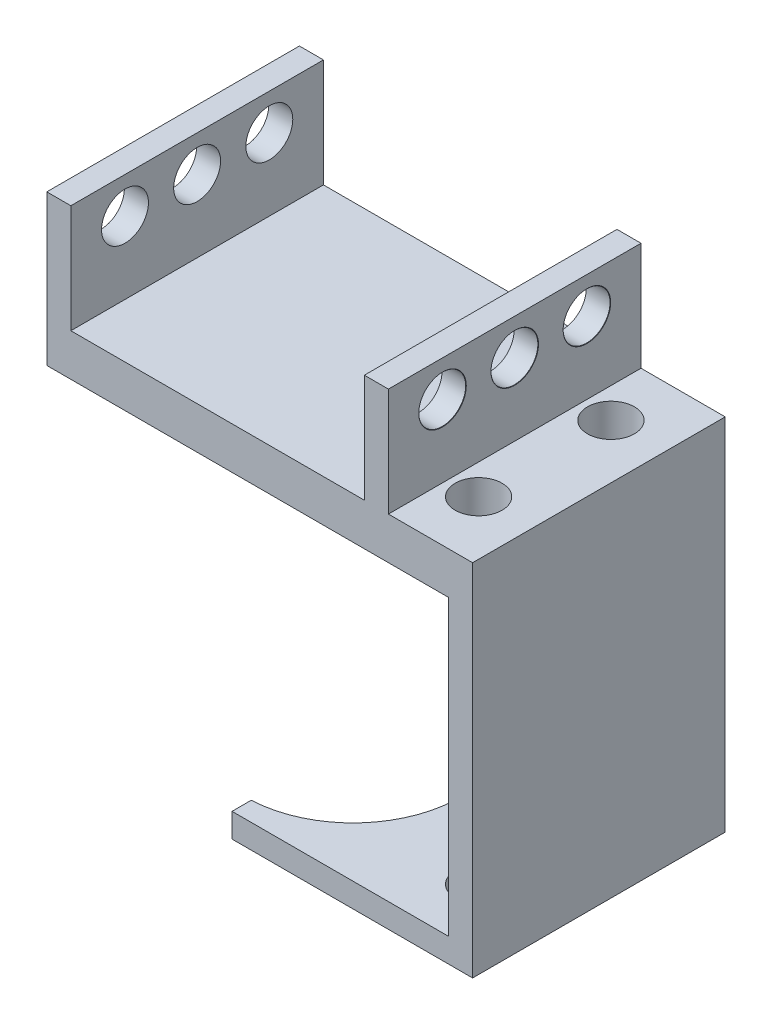
ISO-10303-21;
HEADER;
FILE_DESCRIPTION(('STEP AP214'),'2;1');
FILE_NAME('part.step','',(''),(''),'','','');
FILE_SCHEMA(('AUTOMOTIVE_DESIGN { 1 0 10303 214 1 1 1 1 }'));
ENDSEC;
DATA;
#1=APPLICATION_CONTEXT('core data for automotive mechanical design processes');
#2=APPLICATION_PROTOCOL_DEFINITION('international standard','automotive_design',2000,#1);
#3=PRODUCT_CONTEXT('',#1,'mechanical');
#4=PRODUCT('Part','Part','',(#3));
#5=PRODUCT_RELATED_PRODUCT_CATEGORY('part','',(#4));
#6=PRODUCT_DEFINITION_FORMATION('','',#4);
#7=PRODUCT_DEFINITION_CONTEXT('part definition',#1,'design');
#8=PRODUCT_DEFINITION('design','',#6,#7);
#9=PRODUCT_DEFINITION_SHAPE('','',#8);
#10=(LENGTH_UNIT() NAMED_UNIT(*) SI_UNIT(.MILLI.,.METRE.));
#11=(NAMED_UNIT(*) PLANE_ANGLE_UNIT() SI_UNIT($,.RADIAN.));
#12=(NAMED_UNIT(*) SI_UNIT($,.STERADIAN.) SOLID_ANGLE_UNIT());
#13=UNCERTAINTY_MEASURE_WITH_UNIT(LENGTH_MEASURE(1.E-05),#10,'distance_accuracy_value','');
#14=(GEOMETRIC_REPRESENTATION_CONTEXT(3) GLOBAL_UNCERTAINTY_ASSIGNED_CONTEXT((#13)) GLOBAL_UNIT_ASSIGNED_CONTEXT((#10,
#11,#12)) REPRESENTATION_CONTEXT('',''));
#15=CARTESIAN_POINT('',(0.,0.,0.));
#16=DIRECTION('',(0.,0.,1.));
#17=DIRECTION('',(1.,0.,0.));
#18=AXIS2_PLACEMENT_3D('',#15,#16,#17);
#19=CARTESIAN_POINT('',(1.42095576008853,-57.9,-21.));
#20=DIRECTION('',(-1.,0.,0.));
#21=DIRECTION('',(0.,0.,1.));
#22=AXIS2_PLACEMENT_3D('',#19,#20,#21);
#23=PLANE('',#22);
#24=DIRECTION('',(0.,-1.,0.));
#25=VECTOR('',#24,1.);
#26=CARTESIAN_POINT('',(1.42095576008853,-56.9,-19.3746327950174));
#27=LINE('',#26,#25);
#28=CARTESIAN_POINT('',(1.42095576008853,-57.9,-19.3746327950174));
#29=VERTEX_POINT('',#28);
#30=CARTESIAN_POINT('',(1.42095576008853,-59.9,-19.3746327950174));
#31=VERTEX_POINT('',#30);
#32=EDGE_CURVE('E288',#29,#31,#27,.T.);
#33=ORIENTED_EDGE('',*,*,#32,.F.);
#34=DIRECTION('',(0.,0.,1.));
#35=VECTOR('',#34,1.);
#36=CARTESIAN_POINT('',(1.42095576008853,-57.9,-21.));
#37=LINE('',#36,#35);
#38=CARTESIAN_POINT('',(1.42095576008853,-57.9,-21.));
#39=VERTEX_POINT('',#38);
#40=EDGE_CURVE('E239',#39,#29,#37,.T.);
#41=ORIENTED_EDGE('',*,*,#40,.F.);
#42=DIRECTION('',(0.,-1.,0.));
#43=VECTOR('',#42,1.);
#44=CARTESIAN_POINT('',(1.42095576008853,-57.9,-21.));
#45=LINE('',#44,#43);
#46=CARTESIAN_POINT('',(1.42095576008853,-59.9,-21.));
#47=VERTEX_POINT('',#46);
#48=EDGE_CURVE('E372',#39,#47,#45,.T.);
#49=ORIENTED_EDGE('',*,*,#48,.T.);
#50=DIRECTION('',(0.,0.,1.));
#51=VECTOR('',#50,1.);
#52=CARTESIAN_POINT('',(1.42095576008853,-59.9,-21.));
#53=LINE('',#52,#51);
#54=EDGE_CURVE('E235',#47,#31,#53,.T.);
#55=ORIENTED_EDGE('',*,*,#54,.T.);
#56=EDGE_LOOP('',(#33,#41,#49,#55));
#57=FACE_BOUND('',#56,.T.);
#58=ADVANCED_FACE('F39',(#57),#23,.T.);
#59=CARTESIAN_POINT('',(-13.9790442399115,-33.5,-21.));
#60=DIRECTION('',(-1.,0.,0.));
#61=DIRECTION('',(0.,0.,1.));
#62=AXIS2_PLACEMENT_3D('',#59,#60,#61);
#63=PLANE('',#62);
#64=CARTESIAN_POINT('',(-13.9790442399115,-24.,-4.49999999999993));
#65=DIRECTION('',(1.,0.,0.));
#66=DIRECTION('',(0.,0.,-1.));
#67=AXIS2_PLACEMENT_3D('',#64,#65,#66);
#68=CIRCLE('',#67,1.94999999999999);
#69=CARTESIAN_POINT('',(-13.9790442399115,-24.,-6.44999999999992));
#70=VERTEX_POINT('',#69);
#71=EDGE_CURVE('E263',#70,#70,#68,.T.);
#72=ORIENTED_EDGE('',*,*,#71,.T.);
#73=EDGE_LOOP('',(#72));
#74=FACE_BOUND('',#73,.T.);
#75=DIRECTION('',(0.,-1.,0.));
#76=VECTOR('',#75,1.);
#77=CARTESIAN_POINT('',(-13.9790442399115,-33.5,0.));
#78=LINE('',#77,#76);
#79=CARTESIAN_POINT('',(-13.9790442399115,-21.,0.));
#80=VERTEX_POINT('',#79);
#81=CARTESIAN_POINT('',(-13.9790442399115,-33.5,0.));
#82=VERTEX_POINT('',#81);
#83=EDGE_CURVE('E197',#80,#82,#78,.T.);
#84=ORIENTED_EDGE('',*,*,#83,.F.);
#85=DIRECTION('',(0.,0.,1.));
#86=VECTOR('',#85,1.);
#87=CARTESIAN_POINT('',(-13.9790442399115,-21.,-21.));
#88=LINE('',#87,#86);
#89=CARTESIAN_POINT('',(-13.9790442399115,-21.,-21.));
#90=VERTEX_POINT('',#89);
#91=EDGE_CURVE('E250',#90,#80,#88,.T.);
#92=ORIENTED_EDGE('',*,*,#91,.F.);
#93=DIRECTION('',(0.,-1.,0.));
#94=VECTOR('',#93,1.);
#95=CARTESIAN_POINT('',(-13.9790442399115,-33.5,-21.));
#96=LINE('',#95,#94);
#97=CARTESIAN_POINT('',(-13.9790442399115,-33.5,-21.));
#98=VERTEX_POINT('',#97);
#99=EDGE_CURVE('E361',#90,#98,#96,.T.);
#100=ORIENTED_EDGE('',*,*,#99,.T.);
#101=DIRECTION('',(0.,0.,1.));
#102=VECTOR('',#101,1.);
#103=CARTESIAN_POINT('',(-13.9790442399115,-33.5,-21.));
#104=LINE('',#103,#102);
#105=EDGE_CURVE('E247',#98,#82,#104,.T.);
#106=ORIENTED_EDGE('',*,*,#105,.T.);
#107=EDGE_LOOP('',(#84,#92,#100,#106));
#108=FACE_BOUND('',#107,.T.);
#109=CARTESIAN_POINT('',(-13.9790442399115,-24.,-16.4999999999999));
#110=DIRECTION('',(1.,0.,0.));
#111=DIRECTION('',(0.,0.,-1.));
#112=AXIS2_PLACEMENT_3D('',#109,#110,#111);
#113=CIRCLE('',#112,1.94999999999999);
#114=CARTESIAN_POINT('',(-13.9790442399115,-24.,-18.4499999999999));
#115=VERTEX_POINT('',#114);
#116=EDGE_CURVE('E347',#115,#115,#113,.T.);
#117=ORIENTED_EDGE('',*,*,#116,.T.);
#118=EDGE_LOOP('',(#117));
#119=FACE_BOUND('',#118,.T.);
#120=CARTESIAN_POINT('',(-13.9790442399115,-24.,-10.4999999999999));
#121=DIRECTION('',(1.,0.,0.));
#122=DIRECTION('',(0.,0.,-1.));
#123=AXIS2_PLACEMENT_3D('',#120,#121,#122);
#124=CIRCLE('',#123,1.94999999999999);
#125=CARTESIAN_POINT('',(-13.9790442399115,-24.,-12.4499999999999));
#126=VERTEX_POINT('',#125);
#127=EDGE_CURVE('E259',#126,#126,#124,.T.);
#128=ORIENTED_EDGE('',*,*,#127,.T.);
#129=EDGE_LOOP('',(#128));
#130=FACE_BOUND('',#129,.T.);
#131=ADVANCED_FACE('F418',(#74,#108,#119,#130),#63,.T.);
#132=CARTESIAN_POINT('',(12.4209557600885,-30.,-21.));
#133=DIRECTION('',(0.,1.,0.));
#134=DIRECTION('',(-1.,0.,0.));
#135=AXIS2_PLACEMENT_3D('',#132,#133,#134);
#136=PLANE('',#135);
#137=DIRECTION('',(-1.,0.,0.));
#138=VECTOR('',#137,1.);
#139=CARTESIAN_POINT('',(12.4209557600885,-30.,0.));
#140=LINE('',#139,#138);
#141=CARTESIAN_POINT('',(12.4209557600885,-30.,0.));
#142=VERTEX_POINT('',#141);
#143=CARTESIAN_POINT('',(-11.9790442399115,-30.,0.));
#144=VERTEX_POINT('',#143);
#145=EDGE_CURVE('E187',#142,#144,#140,.T.);
#146=ORIENTED_EDGE('',*,*,#145,.F.);
#147=DIRECTION('',(0.,0.,1.));
#148=VECTOR('',#147,1.);
#149=CARTESIAN_POINT('',(12.4209557600885,-30.,-21.));
#150=LINE('',#149,#148);
#151=CARTESIAN_POINT('',(12.4209557600885,-30.,-21.));
#152=VERTEX_POINT('',#151);
#153=EDGE_CURVE('E48',#152,#142,#150,.T.);
#154=ORIENTED_EDGE('',*,*,#153,.F.);
#155=DIRECTION('',(-1.,0.,0.));
#156=VECTOR('',#155,1.);
#157=CARTESIAN_POINT('',(12.4209557600885,-30.,-21.));
#158=LINE('',#157,#156);
#159=CARTESIAN_POINT('',(-11.9790442399115,-30.,-21.));
#160=VERTEX_POINT('',#159);
#161=EDGE_CURVE('E227',#152,#160,#158,.T.);
#162=ORIENTED_EDGE('',*,*,#161,.T.);
#163=DIRECTION('',(0.,0.,1.));
#164=VECTOR('',#163,1.);
#165=CARTESIAN_POINT('',(-11.9790442399115,-30.,-21.));
#166=LINE('',#165,#164);
#167=EDGE_CURVE('E120',#160,#144,#166,.T.);
#168=ORIENTED_EDGE('',*,*,#167,.T.);
#169=EDGE_LOOP('',(#146,#154,#162,#168));
#170=FACE_BOUND('',#169,.T.);
#171=ADVANCED_FACE('F41',(#170),#136,.T.);
#172=CARTESIAN_POINT('',(12.4209557600885,-21.,-21.));
#173=DIRECTION('',(-1.,0.,0.));
#174=DIRECTION('',(0.,0.,1.));
#175=AXIS2_PLACEMENT_3D('',#172,#173,#174);
#176=PLANE('',#175);
#177=CARTESIAN_POINT('',(12.4209557600885,-24.,-4.49999999999993));
#178=DIRECTION('',(-1.,0.,0.));
#179=DIRECTION('',(0.,0.,1.));
#180=AXIS2_PLACEMENT_3D('',#177,#178,#179);
#181=CIRCLE('',#180,1.95);
#182=CARTESIAN_POINT('',(12.4209557600885,-24.,-2.54999999999993));
#183=VERTEX_POINT('',#182);
#184=EDGE_CURVE('E262',#183,#183,#181,.T.);
#185=ORIENTED_EDGE('',*,*,#184,.F.);
#186=EDGE_LOOP('',(#185));
#187=FACE_BOUND('',#186,.T.);
#188=CARTESIAN_POINT('',(12.4209557600885,-24.,-10.4999999999999));
#189=DIRECTION('',(-1.,0.,0.));
#190=DIRECTION('',(0.,0.,1.));
#191=AXIS2_PLACEMENT_3D('',#188,#189,#190);
#192=CIRCLE('',#191,1.95);
#193=CARTESIAN_POINT('',(12.4209557600885,-24.,-8.54999999999993));
#194=VERTEX_POINT('',#193);
#195=EDGE_CURVE('E258',#194,#194,#192,.T.);
#196=ORIENTED_EDGE('',*,*,#195,.F.);
#197=EDGE_LOOP('',(#196));
#198=FACE_BOUND('',#197,.T.);
#199=CARTESIAN_POINT('',(12.4209557600885,-24.,-16.4999999999999));
#200=DIRECTION('',(-1.,0.,0.));
#201=DIRECTION('',(0.,0.,1.));
#202=AXIS2_PLACEMENT_3D('',#199,#200,#201);
#203=CIRCLE('',#202,1.95);
#204=CARTESIAN_POINT('',(12.4209557600885,-24.,-14.5499999999999));
#205=VERTEX_POINT('',#204);
#206=EDGE_CURVE('E191',#205,#205,#203,.T.);
#207=ORIENTED_EDGE('',*,*,#206,.F.);
#208=EDGE_LOOP('',(#207));
#209=FACE_BOUND('',#208,.T.);
#210=DIRECTION('',(0.,-1.,0.));
#211=VECTOR('',#210,1.);
#212=CARTESIAN_POINT('',(12.4209557600885,-21.,0.));
#213=LINE('',#212,#211);
#214=CARTESIAN_POINT('',(12.4209557600885,-21.,0.));
#215=VERTEX_POINT('',#214);
#216=EDGE_CURVE('E224',#215,#142,#213,.T.);
#217=ORIENTED_EDGE('',*,*,#216,.F.);
#218=DIRECTION('',(0.,0.,1.));
#219=VECTOR('',#218,1.);
#220=CARTESIAN_POINT('',(12.4209557600885,-21.,-21.));
#221=LINE('',#220,#219);
#222=CARTESIAN_POINT('',(12.4209557600885,-21.,-21.));
#223=VERTEX_POINT('',#222);
#224=EDGE_CURVE('E168',#223,#215,#221,.T.);
#225=ORIENTED_EDGE('',*,*,#224,.F.);
#226=DIRECTION('',(0.,-1.,0.));
#227=VECTOR('',#226,1.);
#228=CARTESIAN_POINT('',(12.4209557600885,-21.,-21.));
#229=LINE('',#228,#227);
#230=EDGE_CURVE('E177',#223,#152,#229,.T.);
#231=ORIENTED_EDGE('',*,*,#230,.T.);
#232=ORIENTED_EDGE('',*,*,#153,.T.);
#233=EDGE_LOOP('',(#217,#225,#231,#232));
#234=FACE_BOUND('',#233,.T.);
#235=ADVANCED_FACE('F424',(#187,#198,#209,#234),#176,.T.);
#236=CARTESIAN_POINT('',(12.4209557600885,-21.,-21.));
#237=DIRECTION('',(0.,1.,0.));
#238=DIRECTION('',(-1.,0.,0.));
#239=AXIS2_PLACEMENT_3D('',#236,#237,#238);
#240=PLANE('',#239);
#241=DIRECTION('',(-1.,0.,0.));
#242=VECTOR('',#241,1.);
#243=CARTESIAN_POINT('',(12.4209557600885,-21.,0.));
#244=LINE('',#243,#242);
#245=CARTESIAN_POINT('',(14.4209557600885,-21.,0.));
#246=VERTEX_POINT('',#245);
#247=EDGE_CURVE('E163',#246,#215,#244,.T.);
#248=ORIENTED_EDGE('',*,*,#247,.F.);
#249=DIRECTION('',(0.,0.,1.));
#250=VECTOR('',#249,1.);
#251=CARTESIAN_POINT('',(14.4209557600885,-21.,-21.));
#252=LINE('',#251,#250);
#253=CARTESIAN_POINT('',(14.4209557600885,-21.,-21.));
#254=VERTEX_POINT('',#253);
#255=EDGE_CURVE('E157',#254,#246,#252,.T.);
#256=ORIENTED_EDGE('',*,*,#255,.F.);
#257=DIRECTION('',(-1.,0.,0.));
#258=VECTOR('',#257,1.);
#259=CARTESIAN_POINT('',(12.4209557600885,-21.,-21.));
#260=LINE('',#259,#258);
#261=EDGE_CURVE('E160',#254,#223,#260,.T.);
#262=ORIENTED_EDGE('',*,*,#261,.T.);
#263=ORIENTED_EDGE('',*,*,#224,.T.);
#264=EDGE_LOOP('',(#248,#256,#262,#263));
#265=FACE_BOUND('',#264,.T.);
#266=ADVANCED_FACE('F159',(#265),#240,.T.);
#267=CARTESIAN_POINT('',(14.4209557600885,-21.,-21.));
#268=DIRECTION('',(1.,0.,0.));
#269=DIRECTION('',(0.,1.,0.));
#270=AXIS2_PLACEMENT_3D('',#267,#268,#269);
#271=PLANE('',#270);
#272=CARTESIAN_POINT('',(14.4209557600885,-24.,-4.49999999999993));
#273=DIRECTION('',(1.,0.,0.));
#274=DIRECTION('',(0.,0.,-1.));
#275=AXIS2_PLACEMENT_3D('',#272,#273,#274);
#276=CIRCLE('',#275,1.975);
#277=CARTESIAN_POINT('',(14.4209557600885,-24.,-6.47499999999993));
#278=VERTEX_POINT('',#277);
#279=EDGE_CURVE('E319',#278,#278,#276,.T.);
#280=ORIENTED_EDGE('',*,*,#279,.F.);
#281=EDGE_LOOP('',(#280));
#282=FACE_BOUND('',#281,.T.);
#283=CARTESIAN_POINT('',(14.4209557600885,-24.,-10.4999999999999));
#284=DIRECTION('',(1.,0.,0.));
#285=DIRECTION('',(0.,0.,-1.));
#286=AXIS2_PLACEMENT_3D('',#283,#284,#285);
#287=CIRCLE('',#286,1.975);
#288=CARTESIAN_POINT('',(14.4209557600885,-24.,-12.4749999999999));
#289=VERTEX_POINT('',#288);
#290=EDGE_CURVE('E331',#289,#289,#287,.T.);
#291=ORIENTED_EDGE('',*,*,#290,.F.);
#292=EDGE_LOOP('',(#291));
#293=FACE_BOUND('',#292,.T.);
#294=CARTESIAN_POINT('',(14.4209557600885,-24.,-16.4999999999999));
#295=DIRECTION('',(1.,0.,0.));
#296=DIRECTION('',(0.,0.,-1.));
#297=AXIS2_PLACEMENT_3D('',#294,#295,#296);
#298=CIRCLE('',#297,1.975);
#299=CARTESIAN_POINT('',(14.4209557600885,-24.,-18.4749999999999));
#300=VERTEX_POINT('',#299);
#301=EDGE_CURVE('E341',#300,#300,#298,.T.);
#302=ORIENTED_EDGE('',*,*,#301,.F.);
#303=EDGE_LOOP('',(#302));
#304=FACE_BOUND('',#303,.T.);
#305=DIRECTION('',(0.,1.,0.));
#306=VECTOR('',#305,1.);
#307=CARTESIAN_POINT('',(14.4209557600885,-21.,0.));
#308=LINE('',#307,#306);
#309=CARTESIAN_POINT('',(14.4209557600885,-30.,0.));
#310=VERTEX_POINT('',#309);
#311=EDGE_CURVE('E221',#310,#246,#308,.T.);
#312=ORIENTED_EDGE('',*,*,#311,.F.);
#313=DIRECTION('',(0.,0.,1.));
#314=VECTOR('',#313,1.);
#315=CARTESIAN_POINT('',(14.4209557600885,-30.,-21.));
#316=LINE('',#315,#314);
#317=CARTESIAN_POINT('',(14.4209557600885,-30.,-21.));
#318=VERTEX_POINT('',#317);
#319=EDGE_CURVE('E169',#318,#310,#316,.T.);
#320=ORIENTED_EDGE('',*,*,#319,.F.);
#321=DIRECTION('',(0.,1.,0.));
#322=VECTOR('',#321,1.);
#323=CARTESIAN_POINT('',(14.4209557600885,-21.,-21.));
#324=LINE('',#323,#322);
#325=EDGE_CURVE('E175',#318,#254,#324,.T.);
#326=ORIENTED_EDGE('',*,*,#325,.T.);
#327=ORIENTED_EDGE('',*,*,#255,.T.);
#328=EDGE_LOOP('',(#312,#320,#326,#327));
#329=FACE_BOUND('',#328,.T.);
#330=ADVANCED_FACE('F179',(#282,#293,#304,#329),#271,.T.);
#331=CARTESIAN_POINT('',(14.4209557600885,-30.,-21.));
#332=DIRECTION('',(0.,1.,0.));
#333=DIRECTION('',(0.,0.,1.));
#334=AXIS2_PLACEMENT_3D('',#331,#332,#333);
#335=PLANE('',#334);
#336=CARTESIAN_POINT('',(16.9209557600885,-30.,-16.));
#337=DIRECTION('',(0.,1.,0.));
#338=DIRECTION('',(0.,0.,1.));
#339=AXIS2_PLACEMENT_3D('',#336,#337,#338);
#340=CIRCLE('',#339,1.94999999999999);
#341=CARTESIAN_POINT('',(16.9209557600885,-30.,-14.05));
#342=VERTEX_POINT('',#341);
#343=EDGE_CURVE('E279',#342,#342,#340,.T.);
#344=ORIENTED_EDGE('',*,*,#343,.F.);
#345=EDGE_LOOP('',(#344));
#346=FACE_BOUND('',#345,.T.);
#347=CARTESIAN_POINT('',(16.9209557600885,-30.,-5.));
#348=DIRECTION('',(0.,1.,0.));
#349=DIRECTION('',(0.,0.,1.));
#350=AXIS2_PLACEMENT_3D('',#347,#348,#349);
#351=CIRCLE('',#350,1.94999999999999);
#352=CARTESIAN_POINT('',(16.9209557600885,-30.,-3.05000000000001));
#353=VERTEX_POINT('',#352);
#354=EDGE_CURVE('E271',#353,#353,#351,.T.);
#355=ORIENTED_EDGE('',*,*,#354,.F.);
#356=EDGE_LOOP('',(#355));
#357=FACE_BOUND('',#356,.T.);
#358=DIRECTION('',(-1.,0.,0.));
#359=VECTOR('',#358,1.);
#360=CARTESIAN_POINT('',(14.4209557600885,-30.,0.));
#361=LINE('',#360,#359);
#362=CARTESIAN_POINT('',(21.4209557600885,-30.,0.));
#363=VERTEX_POINT('',#362);
#364=EDGE_CURVE('E218',#363,#310,#361,.T.);
#365=ORIENTED_EDGE('',*,*,#364,.F.);
#366=DIRECTION('',(0.,0.,1.));
#367=VECTOR('',#366,1.);
#368=CARTESIAN_POINT('',(21.4209557600885,-30.,-21.));
#369=LINE('',#368,#367);
#370=CARTESIAN_POINT('',(21.4209557600885,-30.,-21.));
#371=VERTEX_POINT('',#370);
#372=EDGE_CURVE('E231',#371,#363,#369,.T.);
#373=ORIENTED_EDGE('',*,*,#372,.F.);
#374=DIRECTION('',(-1.,0.,0.));
#375=VECTOR('',#374,1.);
#376=CARTESIAN_POINT('',(14.4209557600885,-30.,-21.));
#377=LINE('',#376,#375);
#378=EDGE_CURVE('E180',#371,#318,#377,.T.);
#379=ORIENTED_EDGE('',*,*,#378,.T.);
#380=ORIENTED_EDGE('',*,*,#319,.T.);
#381=EDGE_LOOP('',(#365,#373,#379,#380));
#382=FACE_BOUND('',#381,.T.);
#383=ADVANCED_FACE('F426',(#346,#357,#382),#335,.T.);
#384=CARTESIAN_POINT('',(21.4209557600885,-30.,-21.));
#385=DIRECTION('',(1.,0.,0.));
#386=DIRECTION('',(0.,1.,0.));
#387=AXIS2_PLACEMENT_3D('',#384,#385,#386);
#388=PLANE('',#387);
#389=DIRECTION('',(0.,1.,0.));
#390=VECTOR('',#389,1.);
#391=CARTESIAN_POINT('',(21.4209557600885,-30.,0.));
#392=LINE('',#391,#390);
#393=CARTESIAN_POINT('',(21.4209557600885,-59.9,0.));
#394=VERTEX_POINT('',#393);
#395=EDGE_CURVE('E215',#394,#363,#392,.T.);
#396=ORIENTED_EDGE('',*,*,#395,.F.);
#397=DIRECTION('',(0.,0.,1.));
#398=VECTOR('',#397,1.);
#399=CARTESIAN_POINT('',(21.4209557600885,-59.9,-21.));
#400=LINE('',#399,#398);
#401=CARTESIAN_POINT('',(21.4209557600885,-59.9,-21.));
#402=VERTEX_POINT('',#401);
#403=EDGE_CURVE('E233',#402,#394,#400,.T.);
#404=ORIENTED_EDGE('',*,*,#403,.F.);
#405=DIRECTION('',(0.,1.,0.));
#406=VECTOR('',#405,1.);
#407=CARTESIAN_POINT('',(21.4209557600885,-30.,-21.));
#408=LINE('',#407,#406);
#409=EDGE_CURVE('E182',#402,#371,#408,.T.);
#410=ORIENTED_EDGE('',*,*,#409,.T.);
#411=ORIENTED_EDGE('',*,*,#372,.T.);
#412=EDGE_LOOP('',(#396,#404,#410,#411));
#413=FACE_BOUND('',#412,.T.);
#414=ADVANCED_FACE('F381',(#413),#388,.T.);
#415=CARTESIAN_POINT('',(1.42095576008853,-59.9,-21.));
#416=DIRECTION('',(0.,-1.,0.));
#417=DIRECTION('',(0.,0.,-1.));
#418=AXIS2_PLACEMENT_3D('',#415,#416,#417);
#419=PLANE('',#418);
#420=CARTESIAN_POINT('',(16.9209557600885,-59.9,-16.));
#421=DIRECTION('',(0.,-1.,0.));
#422=DIRECTION('',(0.,0.,-1.));
#423=AXIS2_PLACEMENT_3D('',#420,#421,#422);
#424=CIRCLE('',#423,1.975);
#425=CARTESIAN_POINT('',(16.9209557600885,-59.9,-17.975));
#426=VERTEX_POINT('',#425);
#427=EDGE_CURVE('E460',#426,#426,#424,.T.);
#428=ORIENTED_EDGE('',*,*,#427,.F.);
#429=EDGE_LOOP('',(#428));
#430=FACE_BOUND('',#429,.T.);
#431=CARTESIAN_POINT('',(16.9209557600885,-59.9,-5.));
#432=DIRECTION('',(0.,-1.,0.));
#433=DIRECTION('',(0.,0.,-1.));
#434=AXIS2_PLACEMENT_3D('',#431,#432,#433);
#435=CIRCLE('',#434,1.975);
#436=CARTESIAN_POINT('',(16.9209557600885,-59.9,-6.975));
#437=VERTEX_POINT('',#436);
#438=EDGE_CURVE('E274',#437,#437,#435,.T.);
#439=ORIENTED_EDGE('',*,*,#438,.F.);
#440=EDGE_LOOP('',(#439));
#441=FACE_BOUND('',#440,.T.);
#442=CARTESIAN_POINT('',(0.994754540356649,-59.9,-10.484843566903));
#443=DIRECTION('',(0.,-1.,0.));
#444=DIRECTION('',(0.,0.,-1.));
#445=AXIS2_PLACEMENT_3D('',#442,#443,#444);
#446=CIRCLE('',#445,8.9);
#447=CARTESIAN_POINT('',(1.42095576008853,-59.9,-1.59505433878858));
#448=VERTEX_POINT('',#447);
#449=EDGE_CURVE('E285',#31,#448,#446,.T.);
#450=ORIENTED_EDGE('',*,*,#449,.F.);
#451=ORIENTED_EDGE('',*,*,#54,.F.);
#452=DIRECTION('',(1.,0.,0.));
#453=VECTOR('',#452,1.);
#454=CARTESIAN_POINT('',(1.42095576008853,-59.9,-21.));
#455=LINE('',#454,#453);
#456=EDGE_CURVE('E375',#47,#402,#455,.T.);
#457=ORIENTED_EDGE('',*,*,#456,.T.);
#458=ORIENTED_EDGE('',*,*,#403,.T.);
#459=DIRECTION('',(1.,0.,0.));
#460=VECTOR('',#459,1.);
#461=CARTESIAN_POINT('',(1.42095576008853,-59.9,0.));
#462=LINE('',#461,#460);
#463=CARTESIAN_POINT('',(1.42095576008853,-59.9,0.));
#464=VERTEX_POINT('',#463);
#465=EDGE_CURVE('E212',#464,#394,#462,.T.);
#466=ORIENTED_EDGE('',*,*,#465,.F.);
#467=EDGE_CURVE('E238',#448,#464,#53,.T.);
#468=ORIENTED_EDGE('',*,*,#467,.F.);
#469=EDGE_LOOP('',(#450,#451,#457,#458,#466,#468));
#470=FACE_BOUND('',#469,.T.);
#471=ADVANCED_FACE('F387',(#430,#441,#470),#419,.T.);
#472=DIRECTION('',(0.,-1.,0.));
#473=VECTOR('',#472,1.);
#474=CARTESIAN_POINT('',(1.42095576008853,-56.9,-1.59505433878858));
#475=LINE('',#474,#473);
#476=CARTESIAN_POINT('',(1.42095576008853,-57.9,-1.59505433878858));
#477=VERTEX_POINT('',#476);
#478=EDGE_CURVE('E55',#448,#477,#475,.F.);
#479=ORIENTED_EDGE('',*,*,#478,.F.);
#480=ORIENTED_EDGE('',*,*,#467,.T.);
#481=DIRECTION('',(0.,-1.,0.));
#482=VECTOR('',#481,1.);
#483=CARTESIAN_POINT('',(1.42095576008853,-57.9,0.));
#484=LINE('',#483,#482);
#485=CARTESIAN_POINT('',(1.42095576008853,-57.9,0.));
#486=VERTEX_POINT('',#485);
#487=EDGE_CURVE('E209',#486,#464,#484,.T.);
#488=ORIENTED_EDGE('',*,*,#487,.F.);
#489=EDGE_CURVE('E242',#477,#486,#37,.T.);
#490=ORIENTED_EDGE('',*,*,#489,.F.);
#491=EDGE_LOOP('',(#479,#480,#488,#490));
#492=FACE_BOUND('',#491,.T.);
#493=ADVANCED_FACE('F402',(#492),#23,.T.);
#494=CARTESIAN_POINT('',(19.4209557600885,-57.9,-21.));
#495=DIRECTION('',(0.,1.,0.));
#496=DIRECTION('',(0.,0.,1.));
#497=AXIS2_PLACEMENT_3D('',#494,#495,#496);
#498=PLANE('',#497);
#499=CARTESIAN_POINT('',(16.9209557600885,-57.9,-16.));
#500=DIRECTION('',(0.,1.,0.));
#501=DIRECTION('',(0.,0.,1.));
#502=AXIS2_PLACEMENT_3D('',#499,#500,#501);
#503=CIRCLE('',#502,1.94999999999999);
#504=CARTESIAN_POINT('',(16.9209557600885,-57.9,-14.05));
#505=VERTEX_POINT('',#504);
#506=EDGE_CURVE('E828',#505,#505,#503,.T.);
#507=ORIENTED_EDGE('',*,*,#506,.F.);
#508=EDGE_LOOP('',(#507));
#509=FACE_BOUND('',#508,.T.);
#510=CARTESIAN_POINT('',(16.9209557600885,-57.9,-5.));
#511=DIRECTION('',(0.,1.,0.));
#512=DIRECTION('',(0.,0.,1.));
#513=AXIS2_PLACEMENT_3D('',#510,#511,#512);
#514=CIRCLE('',#513,1.94999999999999);
#515=CARTESIAN_POINT('',(16.9209557600885,-57.9,-3.05000000000001));
#516=VERTEX_POINT('',#515);
#517=EDGE_CURVE('E264',#516,#516,#514,.T.);
#518=ORIENTED_EDGE('',*,*,#517,.F.);
#519=EDGE_LOOP('',(#518));
#520=FACE_BOUND('',#519,.T.);
#521=CARTESIAN_POINT('',(0.994754540356649,-57.9,-10.484843566903));
#522=DIRECTION('',(0.,1.,0.));
#523=DIRECTION('',(0.,0.,1.));
#524=AXIS2_PLACEMENT_3D('',#521,#522,#523);
#525=CIRCLE('',#524,8.9);
#526=EDGE_CURVE('E12',#477,#29,#525,.T.);
#527=ORIENTED_EDGE('',*,*,#526,.F.);
#528=ORIENTED_EDGE('',*,*,#489,.T.);
#529=DIRECTION('',(-1.,0.,0.));
#530=VECTOR('',#529,1.);
#531=CARTESIAN_POINT('',(19.4209557600885,-57.9,0.));
#532=LINE('',#531,#530);
#533=CARTESIAN_POINT('',(19.4209557600885,-57.9,0.));
#534=VERTEX_POINT('',#533);
#535=EDGE_CURVE('E206',#534,#486,#532,.T.);
#536=ORIENTED_EDGE('',*,*,#535,.F.);
#537=DIRECTION('',(0.,0.,1.));
#538=VECTOR('',#537,1.);
#539=CARTESIAN_POINT('',(19.4209557600885,-57.9,-21.));
#540=LINE('',#539,#538);
#541=CARTESIAN_POINT('',(19.4209557600885,-57.9,-21.));
#542=VERTEX_POINT('',#541);
#543=EDGE_CURVE('E243',#542,#534,#540,.T.);
#544=ORIENTED_EDGE('',*,*,#543,.F.);
#545=DIRECTION('',(-1.,0.,0.));
#546=VECTOR('',#545,1.);
#547=CARTESIAN_POINT('',(19.4209557600885,-57.9,-21.));
#548=LINE('',#547,#546);
#549=EDGE_CURVE('E369',#542,#39,#548,.T.);
#550=ORIENTED_EDGE('',*,*,#549,.T.);
#551=ORIENTED_EDGE('',*,*,#40,.T.);
#552=EDGE_LOOP('',(#527,#528,#536,#544,#550,#551));
#553=FACE_BOUND('',#552,.T.);
#554=ADVANCED_FACE('F398',(#509,#520,#553),#498,.T.);
#555=CARTESIAN_POINT('',(19.4209557600885,-33.5,-21.));
#556=DIRECTION('',(-1.,0.,0.));
#557=DIRECTION('',(0.,-1.,0.));
#558=AXIS2_PLACEMENT_3D('',#555,#556,#557);
#559=PLANE('',#558);
#560=DIRECTION('',(0.,-1.,0.));
#561=VECTOR('',#560,1.);
#562=CARTESIAN_POINT('',(19.4209557600885,-33.5,0.));
#563=LINE('',#562,#561);
#564=CARTESIAN_POINT('',(19.4209557600885,-33.5,0.));
#565=VERTEX_POINT('',#564);
#566=EDGE_CURVE('E203',#565,#534,#563,.T.);
#567=ORIENTED_EDGE('',*,*,#566,.F.);
#568=DIRECTION('',(0.,0.,1.));
#569=VECTOR('',#568,1.);
#570=CARTESIAN_POINT('',(19.4209557600885,-33.5,-21.));
#571=LINE('',#570,#569);
#572=CARTESIAN_POINT('',(19.4209557600885,-33.5,-21.));
#573=VERTEX_POINT('',#572);
#574=EDGE_CURVE('E245',#573,#565,#571,.T.);
#575=ORIENTED_EDGE('',*,*,#574,.F.);
#576=DIRECTION('',(0.,-1.,0.));
#577=VECTOR('',#576,1.);
#578=CARTESIAN_POINT('',(19.4209557600885,-33.5,-21.));
#579=LINE('',#578,#577);
#580=EDGE_CURVE('E366',#573,#542,#579,.T.);
#581=ORIENTED_EDGE('',*,*,#580,.T.);
#582=ORIENTED_EDGE('',*,*,#543,.T.);
#583=EDGE_LOOP('',(#567,#575,#581,#582));
#584=FACE_BOUND('',#583,.T.);
#585=ADVANCED_FACE('F411',(#584),#559,.T.);
#586=CARTESIAN_POINT('',(19.4209557600885,-33.5,-21.));
#587=DIRECTION('',(0.,-1.,0.));
#588=DIRECTION('',(0.,0.,-1.));
#589=AXIS2_PLACEMENT_3D('',#586,#587,#588);
#590=PLANE('',#589);
#591=CARTESIAN_POINT('',(16.9209557600885,-33.5,-16.));
#592=DIRECTION('',(0.,-1.,0.));
#593=DIRECTION('',(0.,0.,-1.));
#594=AXIS2_PLACEMENT_3D('',#591,#592,#593);
#595=CIRCLE('',#594,1.94999999999999);
#596=CARTESIAN_POINT('',(16.9209557600885,-33.5,-17.95));
#597=VERTEX_POINT('',#596);
#598=EDGE_CURVE('E43',#597,#597,#595,.T.);
#599=ORIENTED_EDGE('',*,*,#598,.F.);
#600=EDGE_LOOP('',(#599));
#601=FACE_BOUND('',#600,.T.);
#602=CARTESIAN_POINT('',(16.9209557600885,-33.5,-5.));
#603=DIRECTION('',(0.,-1.,0.));
#604=DIRECTION('',(0.,0.,-1.));
#605=AXIS2_PLACEMENT_3D('',#602,#603,#604);
#606=CIRCLE('',#605,1.94999999999999);
#607=CARTESIAN_POINT('',(16.9209557600885,-33.5,-6.94999999999999));
#608=VERTEX_POINT('',#607);
#609=EDGE_CURVE('E266',#608,#608,#606,.T.);
#610=ORIENTED_EDGE('',*,*,#609,.F.);
#611=EDGE_LOOP('',(#610));
#612=FACE_BOUND('',#611,.T.);
#613=CARTESIAN_POINT('',(1.42095576008852,-33.5,-10.5));
#614=DIRECTION('',(0.,-1.,0.));
#615=DIRECTION('',(1.,0.,0.));
#616=AXIS2_PLACEMENT_3D('',#613,#614,#615);
#617=CIRCLE('',#616,9.00000000000001);
#618=CARTESIAN_POINT('',(10.4209557600885,-33.5,-10.5));
#619=VERTEX_POINT('',#618);
#620=EDGE_CURVE('E313',#619,#619,#617,.T.);
#621=ORIENTED_EDGE('',*,*,#620,.F.);
#622=EDGE_LOOP('',(#621));
#623=FACE_BOUND('',#622,.T.);
#624=DIRECTION('',(1.,0.,0.));
#625=VECTOR('',#624,1.);
#626=CARTESIAN_POINT('',(19.4209557600885,-33.5,0.));
#627=LINE('',#626,#625);
#628=EDGE_CURVE('E200',#82,#565,#627,.T.);
#629=ORIENTED_EDGE('',*,*,#628,.F.);
#630=ORIENTED_EDGE('',*,*,#105,.F.);
#631=DIRECTION('',(1.,0.,0.));
#632=VECTOR('',#631,1.);
#633=CARTESIAN_POINT('',(14.4209557600885,-33.5,-21.));
#634=LINE('',#633,#632);
#635=EDGE_CURVE('E364',#98,#573,#634,.T.);
#636=ORIENTED_EDGE('',*,*,#635,.T.);
#637=ORIENTED_EDGE('',*,*,#574,.T.);
#638=EDGE_LOOP('',(#629,#630,#636,#637));
#639=FACE_BOUND('',#638,.T.);
#640=ADVANCED_FACE('F413',(#601,#612,#623,#639),#590,.T.);
#641=CARTESIAN_POINT('',(-13.9790442399115,-21.,-21.));
#642=DIRECTION('',(0.,1.,0.));
#643=DIRECTION('',(0.,0.,1.));
#644=AXIS2_PLACEMENT_3D('',#641,#642,#643);
#645=PLANE('',#644);
#646=DIRECTION('',(-1.,0.,0.));
#647=VECTOR('',#646,1.);
#648=CARTESIAN_POINT('',(-13.9790442399115,-21.,0.));
#649=LINE('',#648,#647);
#650=CARTESIAN_POINT('',(-11.9790442399115,-21.,0.));
#651=VERTEX_POINT('',#650);
#652=EDGE_CURVE('E194',#651,#80,#649,.T.);
#653=ORIENTED_EDGE('',*,*,#652,.F.);
#654=DIRECTION('',(0.,0.,1.));
#655=VECTOR('',#654,1.);
#656=CARTESIAN_POINT('',(-11.9790442399115,-21.,-21.));
#657=LINE('',#656,#655);
#658=CARTESIAN_POINT('',(-11.9790442399115,-21.,-21.));
#659=VERTEX_POINT('',#658);
#660=EDGE_CURVE('E252',#659,#651,#657,.T.);
#661=ORIENTED_EDGE('',*,*,#660,.F.);
#662=DIRECTION('',(-1.,0.,0.));
#663=VECTOR('',#662,1.);
#664=CARTESIAN_POINT('',(-13.9790442399115,-21.,-21.));
#665=LINE('',#664,#663);
#666=EDGE_CURVE('E358',#659,#90,#665,.T.);
#667=ORIENTED_EDGE('',*,*,#666,.T.);
#668=ORIENTED_EDGE('',*,*,#91,.T.);
#669=EDGE_LOOP('',(#653,#661,#667,#668));
#670=FACE_BOUND('',#669,.T.);
#671=ADVANCED_FACE('F422',(#670),#645,.T.);
#672=CARTESIAN_POINT('',(-11.9790442399115,-30.,-21.));
#673=DIRECTION('',(1.,0.,0.));
#674=DIRECTION('',(0.,0.,-1.));
#675=AXIS2_PLACEMENT_3D('',#672,#673,#674);
#676=PLANE('',#675);
#677=CARTESIAN_POINT('',(-11.9790442399115,-24.,-4.49999999999993));
#678=DIRECTION('',(1.,0.,0.));
#679=DIRECTION('',(0.,0.,-1.));
#680=AXIS2_PLACEMENT_3D('',#677,#678,#679);
#681=CIRCLE('',#680,1.95);
#682=CARTESIAN_POINT('',(-11.9790442399115,-24.,-6.44999999999992));
#683=VERTEX_POINT('',#682);
#684=EDGE_CURVE('E260',#683,#683,#681,.T.);
#685=ORIENTED_EDGE('',*,*,#684,.F.);
#686=EDGE_LOOP('',(#685));
#687=FACE_BOUND('',#686,.T.);
#688=CARTESIAN_POINT('',(-11.9790442399115,-24.,-10.4999999999999));
#689=DIRECTION('',(1.,0.,0.));
#690=DIRECTION('',(0.,0.,-1.));
#691=AXIS2_PLACEMENT_3D('',#688,#689,#690);
#692=CIRCLE('',#691,1.95);
#693=CARTESIAN_POINT('',(-11.9790442399115,-24.,-12.4499999999999));
#694=VERTEX_POINT('',#693);
#695=EDGE_CURVE('E255',#694,#694,#692,.T.);
#696=ORIENTED_EDGE('',*,*,#695,.F.);
#697=EDGE_LOOP('',(#696));
#698=FACE_BOUND('',#697,.T.);
#699=CARTESIAN_POINT('',(-11.9790442399115,-24.,-16.4999999999999));
#700=DIRECTION('',(1.,0.,0.));
#701=DIRECTION('',(0.,0.,-1.));
#702=AXIS2_PLACEMENT_3D('',#699,#700,#701);
#703=CIRCLE('',#702,1.95);
#704=CARTESIAN_POINT('',(-11.9790442399115,-24.,-18.4499999999999));
#705=VERTEX_POINT('',#704);
#706=EDGE_CURVE('E350',#705,#705,#703,.T.);
#707=ORIENTED_EDGE('',*,*,#706,.F.);
#708=EDGE_LOOP('',(#707));
#709=FACE_BOUND('',#708,.T.);
#710=DIRECTION('',(0.,1.,0.));
#711=VECTOR('',#710,1.);
#712=CARTESIAN_POINT('',(-11.9790442399115,-30.,0.));
#713=LINE('',#712,#711);
#714=EDGE_CURVE('E190',#144,#651,#713,.T.);
#715=ORIENTED_EDGE('',*,*,#714,.F.);
#716=ORIENTED_EDGE('',*,*,#167,.F.);
#717=DIRECTION('',(0.,1.,0.));
#718=VECTOR('',#717,1.);
#719=CARTESIAN_POINT('',(-11.9790442399115,-30.,-21.));
#720=LINE('',#719,#718);
#721=EDGE_CURVE('E356',#160,#659,#720,.T.);
#722=ORIENTED_EDGE('',*,*,#721,.T.);
#723=ORIENTED_EDGE('',*,*,#660,.T.);
#724=EDGE_LOOP('',(#715,#716,#722,#723));
#725=FACE_BOUND('',#724,.T.);
#726=ADVANCED_FACE('F423',(#687,#698,#709,#725),#676,.T.);
#727=CARTESIAN_POINT('',(0.,0.,-21.));
#728=DIRECTION('',(0.,0.,-1.));
#729=DIRECTION('',(-1.,0.,0.));
#730=AXIS2_PLACEMENT_3D('',#727,#728,#729);
#731=PLANE('',#730);
#732=ORIENTED_EDGE('',*,*,#161,.F.);
#733=ORIENTED_EDGE('',*,*,#230,.F.);
#734=ORIENTED_EDGE('',*,*,#261,.F.);
#735=ORIENTED_EDGE('',*,*,#325,.F.);
#736=ORIENTED_EDGE('',*,*,#378,.F.);
#737=ORIENTED_EDGE('',*,*,#409,.F.);
#738=ORIENTED_EDGE('',*,*,#456,.F.);
#739=ORIENTED_EDGE('',*,*,#48,.F.);
#740=ORIENTED_EDGE('',*,*,#549,.F.);
#741=ORIENTED_EDGE('',*,*,#580,.F.);
#742=ORIENTED_EDGE('',*,*,#635,.F.);
#743=ORIENTED_EDGE('',*,*,#99,.F.);
#744=ORIENTED_EDGE('',*,*,#666,.F.);
#745=ORIENTED_EDGE('',*,*,#721,.F.);
#746=EDGE_LOOP('',(#732,#733,#734,#735,#736,#737,#738,#739,#740,#741,#742,#743,#744,#745));
#747=FACE_BOUND('',#746,.T.);
#748=ADVANCED_FACE('F173',(#747),#731,.T.);
#749=CARTESIAN_POINT('',(0.,0.,0.));
#750=DIRECTION('',(0.,0.,-1.));
#751=DIRECTION('',(-1.,0.,0.));
#752=AXIS2_PLACEMENT_3D('',#749,#750,#751);
#753=PLANE('',#752);
#754=ORIENTED_EDGE('',*,*,#145,.T.);
#755=ORIENTED_EDGE('',*,*,#714,.T.);
#756=ORIENTED_EDGE('',*,*,#652,.T.);
#757=ORIENTED_EDGE('',*,*,#83,.T.);
#758=ORIENTED_EDGE('',*,*,#628,.T.);
#759=ORIENTED_EDGE('',*,*,#566,.T.);
#760=ORIENTED_EDGE('',*,*,#535,.T.);
#761=ORIENTED_EDGE('',*,*,#487,.T.);
#762=ORIENTED_EDGE('',*,*,#465,.T.);
#763=ORIENTED_EDGE('',*,*,#395,.T.);
#764=ORIENTED_EDGE('',*,*,#364,.T.);
#765=ORIENTED_EDGE('',*,*,#311,.T.);
#766=ORIENTED_EDGE('',*,*,#247,.T.);
#767=ORIENTED_EDGE('',*,*,#216,.T.);
#768=EDGE_LOOP('',(#754,#755,#756,#757,#758,#759,#760,#761,#762,#763,#764,#765,#766,#767));
#769=FACE_BOUND('',#768,.T.);
#770=ADVANCED_FACE('F404',(#769),#753,.F.);
#771=CARTESIAN_POINT('',(14.4209557600885,-24.,-16.4999999999999));
#772=DIRECTION('',(1.,0.,0.));
#773=DIRECTION('',(0.,0.,-1.));
#774=AXIS2_PLACEMENT_3D('',#771,#772,#773);
#775=CYLINDRICAL_SURFACE('',#774,1.95);
#776=ORIENTED_EDGE('',*,*,#706,.T.);
#777=EDGE_LOOP('',(#776));
#778=FACE_BOUND('',#777,.T.);
#779=ORIENTED_EDGE('',*,*,#116,.F.);
#780=EDGE_LOOP('',(#779));
#781=FACE_BOUND('',#780,.T.);
#782=ADVANCED_FACE('F530',(#778,#781),#775,.F.);
#783=ORIENTED_EDGE('',*,*,#206,.T.);
#784=EDGE_LOOP('',(#783));
#785=FACE_BOUND('',#784,.T.);
#786=CARTESIAN_POINT('',(14.3959557600885,-24.,-16.4999999999999));
#787=DIRECTION('',(1.,0.,0.));
#788=DIRECTION('',(0.,0.,-1.));
#789=AXIS2_PLACEMENT_3D('',#786,#787,#788);
#790=CIRCLE('',#789,1.95);
#791=CARTESIAN_POINT('',(14.3959557600885,-24.,-18.4499999999999));
#792=VERTEX_POINT('',#791);
#793=EDGE_CURVE('E344',#792,#792,#790,.T.);
#794=ORIENTED_EDGE('',*,*,#793,.T.);
#795=EDGE_LOOP('',(#794));
#796=FACE_BOUND('',#795,.T.);
#797=ADVANCED_FACE('F528',(#785,#796),#775,.F.);
#798=CARTESIAN_POINT('',(14.4209557600885,-24.,-16.4999999999999));
#799=DIRECTION('',(1.,0.,0.));
#800=DIRECTION('',(0.,0.,-1.));
#801=AXIS2_PLACEMENT_3D('',#798,#799,#800);
#802=CONICAL_SURFACE('',#801,1.975,0.785398163397483);
#803=ORIENTED_EDGE('',*,*,#793,.F.);
#804=EDGE_LOOP('',(#803));
#805=FACE_BOUND('',#804,.T.);
#806=ORIENTED_EDGE('',*,*,#301,.T.);
#807=EDGE_LOOP('',(#806));
#808=FACE_BOUND('',#807,.T.);
#809=ADVANCED_FACE('F524',(#805,#808),#802,.F.);
#810=CARTESIAN_POINT('',(14.4209557600885,-24.,-10.4999999999999));
#811=DIRECTION('',(1.,0.,0.));
#812=DIRECTION('',(0.,0.,-1.));
#813=AXIS2_PLACEMENT_3D('',#810,#811,#812);
#814=CYLINDRICAL_SURFACE('',#813,1.95);
#815=ORIENTED_EDGE('',*,*,#695,.T.);
#816=EDGE_LOOP('',(#815));
#817=FACE_BOUND('',#816,.T.);
#818=ORIENTED_EDGE('',*,*,#127,.F.);
#819=EDGE_LOOP('',(#818));
#820=FACE_BOUND('',#819,.T.);
#821=ADVANCED_FACE('F521',(#817,#820),#814,.F.);
#822=ORIENTED_EDGE('',*,*,#195,.T.);
#823=EDGE_LOOP('',(#822));
#824=FACE_BOUND('',#823,.T.);
#825=CARTESIAN_POINT('',(14.3959557600885,-24.,-10.4999999999999));
#826=DIRECTION('',(1.,0.,0.));
#827=DIRECTION('',(0.,0.,-1.));
#828=AXIS2_PLACEMENT_3D('',#825,#826,#827);
#829=CIRCLE('',#828,1.95);
#830=CARTESIAN_POINT('',(14.3959557600885,-24.,-12.4499999999999));
#831=VERTEX_POINT('',#830);
#832=EDGE_CURVE('E334',#831,#831,#829,.T.);
#833=ORIENTED_EDGE('',*,*,#832,.T.);
#834=EDGE_LOOP('',(#833));
#835=FACE_BOUND('',#834,.T.);
#836=ADVANCED_FACE('F519',(#824,#835),#814,.F.);
#837=CARTESIAN_POINT('',(14.4209557600885,-24.,-10.4999999999999));
#838=DIRECTION('',(1.,0.,0.));
#839=DIRECTION('',(0.,0.,-1.));
#840=AXIS2_PLACEMENT_3D('',#837,#838,#839);
#841=CONICAL_SURFACE('',#840,1.975,0.785398163397483);
#842=ORIENTED_EDGE('',*,*,#832,.F.);
#843=EDGE_LOOP('',(#842));
#844=FACE_BOUND('',#843,.T.);
#845=ORIENTED_EDGE('',*,*,#290,.T.);
#846=EDGE_LOOP('',(#845));
#847=FACE_BOUND('',#846,.T.);
#848=ADVANCED_FACE('F512',(#844,#847),#841,.F.);
#849=CARTESIAN_POINT('',(14.4209557600885,-24.,-4.49999999999993));
#850=DIRECTION('',(1.,0.,0.));
#851=DIRECTION('',(0.,0.,-1.));
#852=AXIS2_PLACEMENT_3D('',#849,#850,#851);
#853=CONICAL_SURFACE('',#852,1.975,0.785398163397483);
#854=CARTESIAN_POINT('',(14.3959557600885,-24.,-4.49999999999993));
#855=DIRECTION('',(1.,0.,0.));
#856=DIRECTION('',(0.,0.,-1.));
#857=AXIS2_PLACEMENT_3D('',#854,#855,#856);
#858=CIRCLE('',#857,1.95);
#859=CARTESIAN_POINT('',(14.3959557600885,-24.,-6.44999999999992));
#860=VERTEX_POINT('',#859);
#861=EDGE_CURVE('E324',#860,#860,#858,.T.);
#862=ORIENTED_EDGE('',*,*,#861,.F.);
#863=EDGE_LOOP('',(#862));
#864=FACE_BOUND('',#863,.T.);
#865=ORIENTED_EDGE('',*,*,#279,.T.);
#866=EDGE_LOOP('',(#865));
#867=FACE_BOUND('',#866,.T.);
#868=ADVANCED_FACE('F508',(#864,#867),#853,.F.);
#869=CARTESIAN_POINT('',(14.4209557600885,-24.,-4.49999999999993));
#870=DIRECTION('',(1.,0.,0.));
#871=DIRECTION('',(0.,0.,-1.));
#872=AXIS2_PLACEMENT_3D('',#869,#870,#871);
#873=CYLINDRICAL_SURFACE('',#872,1.95);
#874=ORIENTED_EDGE('',*,*,#184,.T.);
#875=EDGE_LOOP('',(#874));
#876=FACE_BOUND('',#875,.T.);
#877=ORIENTED_EDGE('',*,*,#861,.T.);
#878=EDGE_LOOP('',(#877));
#879=FACE_BOUND('',#878,.T.);
#880=ADVANCED_FACE('F511',(#876,#879),#873,.F.);
#881=ORIENTED_EDGE('',*,*,#684,.T.);
#882=EDGE_LOOP('',(#881));
#883=FACE_BOUND('',#882,.T.);
#884=ORIENTED_EDGE('',*,*,#71,.F.);
#885=EDGE_LOOP('',(#884));
#886=FACE_BOUND('',#885,.T.);
#887=ADVANCED_FACE('F506',(#883,#886),#873,.F.);
#888=CARTESIAN_POINT('',(1.42095576008852,-30.5,-10.5));
#889=DIRECTION('',(0.,-1.,0.));
#890=DIRECTION('',(1.,0.,0.));
#891=AXIS2_PLACEMENT_3D('',#888,#889,#890);
#892=CYLINDRICAL_SURFACE('',#891,9.00000000000001);
#893=CARTESIAN_POINT('',(1.42095576008852,-30.5,-10.5));
#894=DIRECTION('',(0.,-1.,0.));
#895=DIRECTION('',(1.,0.,0.));
#896=AXIS2_PLACEMENT_3D('',#893,#894,#895);
#897=CIRCLE('',#896,9.00000000000001);
#898=CARTESIAN_POINT('',(10.4209557600885,-30.5,-10.5));
#899=VERTEX_POINT('',#898);
#900=EDGE_CURVE('E316',#899,#899,#897,.T.);
#901=ORIENTED_EDGE('',*,*,#900,.F.);
#902=EDGE_LOOP('',(#901));
#903=FACE_BOUND('',#902,.T.);
#904=ORIENTED_EDGE('',*,*,#620,.T.);
#905=EDGE_LOOP('',(#904));
#906=FACE_BOUND('',#905,.T.);
#907=ADVANCED_FACE('F502',(#903,#906),#892,.F.);
#908=CARTESIAN_POINT('',(1.42095576008852,-30.5,-10.5));
#909=DIRECTION('',(0.,-1.,0.));
#910=DIRECTION('',(1.,0.,0.));
#911=AXIS2_PLACEMENT_3D('',#908,#909,#910);
#912=PLANE('',#911);
#913=CARTESIAN_POINT('',(7.42095576008852,-30.5,-10.5));
#914=DIRECTION('',(0.,-1.,0.));
#915=DIRECTION('',(1.,0.,0.));
#916=AXIS2_PLACEMENT_3D('',#913,#914,#915);
#917=CIRCLE('',#916,2.00000000000001);
#918=CARTESIAN_POINT('',(9.42095576008853,-30.5,-10.5));
#919=VERTEX_POINT('',#918);
#920=EDGE_CURVE('E292',#919,#919,#917,.T.);
#921=ORIENTED_EDGE('',*,*,#920,.F.);
#922=EDGE_LOOP('',(#921));
#923=FACE_BOUND('',#922,.T.);
#924=CARTESIAN_POINT('',(-4.57904423991148,-30.5,-10.5));
#925=DIRECTION('',(0.,-1.,0.));
#926=DIRECTION('',(1.,0.,0.));
#927=AXIS2_PLACEMENT_3D('',#924,#925,#926);
#928=CIRCLE('',#927,2.);
#929=CARTESIAN_POINT('',(-2.57904423991148,-30.5,-10.5));
#930=VERTEX_POINT('',#929);
#931=EDGE_CURVE('E298',#930,#930,#928,.T.);
#932=ORIENTED_EDGE('',*,*,#931,.F.);
#933=EDGE_LOOP('',(#932));
#934=FACE_BOUND('',#933,.T.);
#935=CARTESIAN_POINT('',(1.42095576008852,-30.5,-16.5));
#936=DIRECTION('',(0.,-1.,0.));
#937=DIRECTION('',(1.,0.,0.));
#938=AXIS2_PLACEMENT_3D('',#935,#936,#937);
#939=CIRCLE('',#938,2.00000000000001);
#940=CARTESIAN_POINT('',(3.42095576008853,-30.5,-16.5));
#941=VERTEX_POINT('',#940);
#942=EDGE_CURVE('E304',#941,#941,#939,.T.);
#943=ORIENTED_EDGE('',*,*,#942,.F.);
#944=EDGE_LOOP('',(#943));
#945=FACE_BOUND('',#944,.T.);
#946=CARTESIAN_POINT('',(1.42095576008852,-30.5,-4.5));
#947=DIRECTION('',(0.,-1.,0.));
#948=DIRECTION('',(1.,0.,0.));
#949=AXIS2_PLACEMENT_3D('',#946,#947,#948);
#950=CIRCLE('',#949,2.);
#951=CARTESIAN_POINT('',(3.42095576008853,-30.5,-4.5));
#952=VERTEX_POINT('',#951);
#953=EDGE_CURVE('E310',#952,#952,#950,.T.);
#954=ORIENTED_EDGE('',*,*,#953,.F.);
#955=EDGE_LOOP('',(#954));
#956=FACE_BOUND('',#955,.T.);
#957=ORIENTED_EDGE('',*,*,#900,.T.);
#958=EDGE_LOOP('',(#957));
#959=FACE_BOUND('',#958,.T.);
#960=ADVANCED_FACE('F498',(#923,#934,#945,#956,#959),#912,.T.);
#961=CARTESIAN_POINT('',(1.42095576008852,-30.5,-4.5));
#962=DIRECTION('',(0.,-1.,0.));
#963=DIRECTION('',(1.,0.,0.));
#964=AXIS2_PLACEMENT_3D('',#961,#962,#963);
#965=CYLINDRICAL_SURFACE('',#964,2.);
#966=ORIENTED_EDGE('',*,*,#953,.T.);
#967=EDGE_LOOP('',(#966));
#968=FACE_BOUND('',#967,.T.);
#969=CARTESIAN_POINT('',(1.42095576008852,-33.5,-4.5));
#970=DIRECTION('',(0.,-1.,0.));
#971=DIRECTION('',(1.,0.,0.));
#972=AXIS2_PLACEMENT_3D('',#969,#970,#971);
#973=CIRCLE('',#972,2.);
#974=CARTESIAN_POINT('',(3.42095576008853,-33.5,-4.5));
#975=VERTEX_POINT('',#974);
#976=EDGE_CURVE('E307',#975,#975,#973,.T.);
#977=ORIENTED_EDGE('',*,*,#976,.F.);
#978=EDGE_LOOP('',(#977));
#979=FACE_BOUND('',#978,.T.);
#980=ADVANCED_FACE('F494',(#968,#979),#965,.T.);
#981=CARTESIAN_POINT('',(1.42095576008852,-30.5,-16.5));
#982=DIRECTION('',(0.,-1.,0.));
#983=DIRECTION('',(1.,0.,0.));
#984=AXIS2_PLACEMENT_3D('',#981,#982,#983);
#985=CYLINDRICAL_SURFACE('',#984,2.00000000000001);
#986=ORIENTED_EDGE('',*,*,#942,.T.);
#987=EDGE_LOOP('',(#986));
#988=FACE_BOUND('',#987,.T.);
#989=CARTESIAN_POINT('',(1.42095576008852,-33.5,-16.5));
#990=DIRECTION('',(0.,-1.,0.));
#991=DIRECTION('',(1.,0.,0.));
#992=AXIS2_PLACEMENT_3D('',#989,#990,#991);
#993=CIRCLE('',#992,2.00000000000001);
#994=CARTESIAN_POINT('',(3.42095576008853,-33.5,-16.5));
#995=VERTEX_POINT('',#994);
#996=EDGE_CURVE('E301',#995,#995,#993,.T.);
#997=ORIENTED_EDGE('',*,*,#996,.F.);
#998=EDGE_LOOP('',(#997));
#999=FACE_BOUND('',#998,.T.);
#1000=ADVANCED_FACE('F490',(#988,#999),#985,.T.);
#1001=CARTESIAN_POINT('',(-4.57904423991148,-30.5,-10.5));
#1002=DIRECTION('',(0.,-1.,0.));
#1003=DIRECTION('',(1.,0.,0.));
#1004=AXIS2_PLACEMENT_3D('',#1001,#1002,#1003);
#1005=CYLINDRICAL_SURFACE('',#1004,2.);
#1006=ORIENTED_EDGE('',*,*,#931,.T.);
#1007=EDGE_LOOP('',(#1006));
#1008=FACE_BOUND('',#1007,.T.);
#1009=CARTESIAN_POINT('',(-4.57904423991148,-33.5,-10.5));
#1010=DIRECTION('',(0.,-1.,0.));
#1011=DIRECTION('',(1.,0.,0.));
#1012=AXIS2_PLACEMENT_3D('',#1009,#1010,#1011);
#1013=CIRCLE('',#1012,2.);
#1014=CARTESIAN_POINT('',(-2.57904423991148,-33.5,-10.5));
#1015=VERTEX_POINT('',#1014);
#1016=EDGE_CURVE('E295',#1015,#1015,#1013,.T.);
#1017=ORIENTED_EDGE('',*,*,#1016,.F.);
#1018=EDGE_LOOP('',(#1017));
#1019=FACE_BOUND('',#1018,.T.);
#1020=ADVANCED_FACE('F486',(#1008,#1019),#1005,.T.);
#1021=CARTESIAN_POINT('',(7.42095576008852,-30.5,-10.5));
#1022=DIRECTION('',(0.,-1.,0.));
#1023=DIRECTION('',(1.,0.,0.));
#1024=AXIS2_PLACEMENT_3D('',#1021,#1022,#1023);
#1025=CYLINDRICAL_SURFACE('',#1024,2.00000000000001);
#1026=ORIENTED_EDGE('',*,*,#920,.T.);
#1027=EDGE_LOOP('',(#1026));
#1028=FACE_BOUND('',#1027,.T.);
#1029=CARTESIAN_POINT('',(7.42095576008852,-33.5,-10.5));
#1030=DIRECTION('',(0.,-1.,0.));
#1031=DIRECTION('',(1.,0.,0.));
#1032=AXIS2_PLACEMENT_3D('',#1029,#1030,#1031);
#1033=CIRCLE('',#1032,2.00000000000001);
#1034=CARTESIAN_POINT('',(9.42095576008853,-33.5,-10.5));
#1035=VERTEX_POINT('',#1034);
#1036=EDGE_CURVE('E291',#1035,#1035,#1033,.T.);
#1037=ORIENTED_EDGE('',*,*,#1036,.F.);
#1038=EDGE_LOOP('',(#1037));
#1039=FACE_BOUND('',#1038,.T.);
#1040=ADVANCED_FACE('F482',(#1028,#1039),#1025,.T.);
#1041=ORIENTED_EDGE('',*,*,#1016,.T.);
#1042=EDGE_LOOP('',(#1041));
#1043=FACE_BOUND('',#1042,.T.);
#1044=ADVANCED_FACE('F485',(#1043),#590,.T.);
#1045=ORIENTED_EDGE('',*,*,#996,.T.);
#1046=EDGE_LOOP('',(#1045));
#1047=FACE_BOUND('',#1046,.T.);
#1048=ADVANCED_FACE('F694',(#1047),#590,.T.);
#1049=ORIENTED_EDGE('',*,*,#976,.T.);
#1050=EDGE_LOOP('',(#1049));
#1051=FACE_BOUND('',#1050,.T.);
#1052=ADVANCED_FACE('F705',(#1051),#590,.T.);
#1053=ORIENTED_EDGE('',*,*,#1036,.T.);
#1054=EDGE_LOOP('',(#1053));
#1055=FACE_BOUND('',#1054,.T.);
#1056=ADVANCED_FACE('F481',(#1055),#590,.T.);
#1057=CARTESIAN_POINT('',(0.994754540356649,-56.9,-10.484843566903));
#1058=DIRECTION('',(0.,-1.,0.));
#1059=DIRECTION('',(0.,0.,-1.));
#1060=AXIS2_PLACEMENT_3D('',#1057,#1058,#1059);
#1061=CYLINDRICAL_SURFACE('',#1060,8.9);
#1062=ORIENTED_EDGE('',*,*,#32,.T.);
#1063=ORIENTED_EDGE('',*,*,#449,.T.);
#1064=ORIENTED_EDGE('',*,*,#478,.T.);
#1065=ORIENTED_EDGE('',*,*,#526,.T.);
#1066=EDGE_LOOP('',(#1062,#1063,#1064,#1065));
#1067=FACE_BOUND('',#1066,.T.);
#1068=ADVANCED_FACE('F395',(#1067),#1061,.F.);
#1069=CARTESIAN_POINT('',(16.9209557600885,-59.9,-5.));
#1070=DIRECTION('',(0.,-1.,0.));
#1071=DIRECTION('',(0.,0.,-1.));
#1072=AXIS2_PLACEMENT_3D('',#1069,#1070,#1071);
#1073=CYLINDRICAL_SURFACE('',#1072,1.94999999999999);
#1074=ORIENTED_EDGE('',*,*,#517,.T.);
#1075=EDGE_LOOP('',(#1074));
#1076=FACE_BOUND('',#1075,.T.);
#1077=CARTESIAN_POINT('',(16.9209557600885,-59.875,-5.));
#1078=DIRECTION('',(0.,-1.,0.));
#1079=DIRECTION('',(0.,0.,-1.));
#1080=AXIS2_PLACEMENT_3D('',#1077,#1078,#1079);
#1081=CIRCLE('',#1080,1.95);
#1082=CARTESIAN_POINT('',(16.9209557600885,-59.875,-6.95));
#1083=VERTEX_POINT('',#1082);
#1084=EDGE_CURVE('E267',#1083,#1083,#1081,.T.);
#1085=ORIENTED_EDGE('',*,*,#1084,.T.);
#1086=EDGE_LOOP('',(#1085));
#1087=FACE_BOUND('',#1086,.T.);
#1088=ADVANCED_FACE('F466',(#1076,#1087),#1073,.F.);
#1089=CARTESIAN_POINT('',(16.9209557600885,-59.9,-5.));
#1090=DIRECTION('',(0.,-1.,0.));
#1091=DIRECTION('',(0.,0.,-1.));
#1092=AXIS2_PLACEMENT_3D('',#1089,#1090,#1091);
#1093=CONICAL_SURFACE('',#1092,1.975,0.785398163397448);
#1094=ORIENTED_EDGE('',*,*,#1084,.F.);
#1095=EDGE_LOOP('',(#1094));
#1096=FACE_BOUND('',#1095,.T.);
#1097=ORIENTED_EDGE('',*,*,#438,.T.);
#1098=EDGE_LOOP('',(#1097));
#1099=FACE_BOUND('',#1098,.T.);
#1100=ADVANCED_FACE('F463',(#1096,#1099),#1093,.F.);
#1101=ORIENTED_EDGE('',*,*,#354,.T.);
#1102=EDGE_LOOP('',(#1101));
#1103=FACE_BOUND('',#1102,.T.);
#1104=ORIENTED_EDGE('',*,*,#609,.T.);
#1105=EDGE_LOOP('',(#1104));
#1106=FACE_BOUND('',#1105,.T.);
#1107=ADVANCED_FACE('F465',(#1103,#1106),#1073,.F.);
#1108=CARTESIAN_POINT('',(16.9209557600885,-59.9,-16.));
#1109=DIRECTION('',(0.,-1.,0.));
#1110=DIRECTION('',(0.,0.,-1.));
#1111=AXIS2_PLACEMENT_3D('',#1108,#1109,#1110);
#1112=CYLINDRICAL_SURFACE('',#1111,1.94999999999999);
#1113=ORIENTED_EDGE('',*,*,#343,.T.);
#1114=EDGE_LOOP('',(#1113));
#1115=FACE_BOUND('',#1114,.T.);
#1116=ORIENTED_EDGE('',*,*,#598,.T.);
#1117=EDGE_LOOP('',(#1116));
#1118=FACE_BOUND('',#1117,.T.);
#1119=ADVANCED_FACE('F473',(#1115,#1118),#1112,.F.);
#1120=ORIENTED_EDGE('',*,*,#506,.T.);
#1121=EDGE_LOOP('',(#1120));
#1122=FACE_BOUND('',#1121,.T.);
#1123=CARTESIAN_POINT('',(16.9209557600885,-59.875,-16.));
#1124=DIRECTION('',(0.,-1.,0.));
#1125=DIRECTION('',(0.,0.,-1.));
#1126=AXIS2_PLACEMENT_3D('',#1123,#1124,#1125);
#1127=CIRCLE('',#1126,1.95);
#1128=CARTESIAN_POINT('',(16.9209557600885,-59.875,-17.95));
#1129=VERTEX_POINT('',#1128);
#1130=EDGE_CURVE('E824',#1129,#1129,#1127,.T.);
#1131=ORIENTED_EDGE('',*,*,#1130,.T.);
#1132=EDGE_LOOP('',(#1131));
#1133=FACE_BOUND('',#1132,.T.);
#1134=ADVANCED_FACE('F790',(#1122,#1133),#1112,.F.);
#1135=CARTESIAN_POINT('',(16.9209557600885,-59.9,-16.));
#1136=DIRECTION('',(0.,-1.,0.));
#1137=DIRECTION('',(0.,0.,-1.));
#1138=AXIS2_PLACEMENT_3D('',#1135,#1136,#1137);
#1139=CONICAL_SURFACE('',#1138,1.975,0.785398163397448);
#1140=ORIENTED_EDGE('',*,*,#1130,.F.);
#1141=EDGE_LOOP('',(#1140));
#1142=FACE_BOUND('',#1141,.T.);
#1143=ORIENTED_EDGE('',*,*,#427,.T.);
#1144=EDGE_LOOP('',(#1143));
#1145=FACE_BOUND('',#1144,.T.);
#1146=ADVANCED_FACE('F800',(#1142,#1145),#1139,.F.);
#1147=CLOSED_SHELL('',(#58,#131,#171,#235,#266,#330,#383,#414,#471,#493,#554,#585,#640,#671,
#726,#748,#770,#782,#797,#809,#821,#836,#848,#868,#880,#887,#907,#960,#980,#1000,#1020,#1040,
#1044,#1048,#1052,#1056,#1068,#1088,#1100,#1107,#1119,#1134,#1146));
#1148=MANIFOLD_SOLID_BREP('B2',#1147);
#1149=ADVANCED_BREP_SHAPE_REPRESENTATION('',(#18,#1148),#14);
#1150=SHAPE_DEFINITION_REPRESENTATION(#9,#1149);
ENDSEC;
END-ISO-10303-21;
